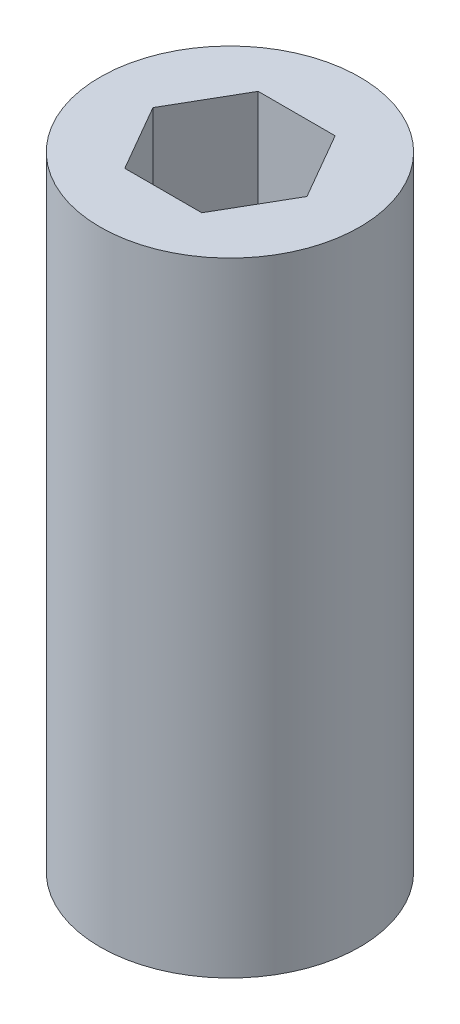
ISO-10303-21;
HEADER;
FILE_DESCRIPTION(('STEP AP214'),'2;1');
FILE_NAME('part.step','',(''),(''),'','','');
FILE_SCHEMA(('AUTOMOTIVE_DESIGN { 1 0 10303 214 1 1 1 1 }'));
ENDSEC;
DATA;
#1=APPLICATION_CONTEXT('core data for automotive mechanical design processes');
#2=APPLICATION_PROTOCOL_DEFINITION('international standard','automotive_design',2000,#1);
#3=PRODUCT_CONTEXT('',#1,'mechanical');
#4=PRODUCT('Part','Part','',(#3));
#5=PRODUCT_RELATED_PRODUCT_CATEGORY('part','',(#4));
#6=PRODUCT_DEFINITION_FORMATION('','',#4);
#7=PRODUCT_DEFINITION_CONTEXT('part definition',#1,'design');
#8=PRODUCT_DEFINITION('design','',#6,#7);
#9=PRODUCT_DEFINITION_SHAPE('','',#8);
#10=(LENGTH_UNIT() NAMED_UNIT(*) SI_UNIT(.MILLI.,.METRE.));
#11=(NAMED_UNIT(*) PLANE_ANGLE_UNIT() SI_UNIT($,.RADIAN.));
#12=(NAMED_UNIT(*) SI_UNIT($,.STERADIAN.) SOLID_ANGLE_UNIT());
#13=UNCERTAINTY_MEASURE_WITH_UNIT(LENGTH_MEASURE(1.E-05),#10,'distance_accuracy_value','');
#14=(GEOMETRIC_REPRESENTATION_CONTEXT(3) GLOBAL_UNCERTAINTY_ASSIGNED_CONTEXT((#13)) GLOBAL_UNIT_ASSIGNED_CONTEXT((#10,
#11,#12)) REPRESENTATION_CONTEXT('',''));
#15=CARTESIAN_POINT('',(0.,0.,0.));
#16=DIRECTION('',(0.,0.,1.));
#17=DIRECTION('',(1.,0.,0.));
#18=AXIS2_PLACEMENT_3D('',#15,#16,#17);
#19=CARTESIAN_POINT('',(0.,45.72,0.));
#20=DIRECTION('',(0.,1.,0.));
#21=DIRECTION('',(0.,0.,1.));
#22=AXIS2_PLACEMENT_3D('',#19,#20,#21);
#23=PLANE('',#22);
#24=CARTESIAN_POINT('',(0.,45.72,0.));
#25=DIRECTION('',(0.,1.,0.));
#26=DIRECTION('',(0.,0.,1.));
#27=AXIS2_PLACEMENT_3D('',#24,#25,#26);
#28=CIRCLE('',#27,9.525);
#29=CARTESIAN_POINT('',(0.,45.72,9.525));
#30=VERTEX_POINT('',#29);
#31=EDGE_CURVE('E11',#30,#30,#28,.T.);
#32=ORIENTED_EDGE('',*,*,#31,.T.);
#33=EDGE_LOOP('',(#32));
#34=FACE_BOUND('',#33,.T.);
#35=DIRECTION('',(-0.5,0.,-0.866025403784439));
#36=VECTOR('',#35,1.);
#37=CARTESIAN_POINT('',(5.64590828240535,45.72,0.));
#38=LINE('',#37,#36);
#39=CARTESIAN_POINT('',(5.64590828240535,45.72,0.));
#40=VERTEX_POINT('',#39);
#41=CARTESIAN_POINT('',(2.82295414120267,45.72,-4.8895));
#42=VERTEX_POINT('',#41);
#43=EDGE_CURVE('E98',#40,#42,#38,.T.);
#44=ORIENTED_EDGE('',*,*,#43,.F.);
#45=DIRECTION('',(0.5,0.,-0.866025403784439));
#46=VECTOR('',#45,1.);
#47=CARTESIAN_POINT('',(2.82295414120267,45.72,4.8895));
#48=LINE('',#47,#46);
#49=CARTESIAN_POINT('',(2.82295414120267,45.72,4.8895));
#50=VERTEX_POINT('',#49);
#51=EDGE_CURVE('E90',#50,#40,#48,.T.);
#52=ORIENTED_EDGE('',*,*,#51,.F.);
#53=DIRECTION('',(1.,0.,0.));
#54=VECTOR('',#53,1.);
#55=CARTESIAN_POINT('',(-2.82295414120268,45.72,4.8895));
#56=LINE('',#55,#54);
#57=CARTESIAN_POINT('',(-2.82295414120268,45.72,4.8895));
#58=VERTEX_POINT('',#57);
#59=EDGE_CURVE('E118',#58,#50,#56,.T.);
#60=ORIENTED_EDGE('',*,*,#59,.F.);
#61=DIRECTION('',(0.5,0.,0.866025403784439));
#62=VECTOR('',#61,1.);
#63=CARTESIAN_POINT('',(-5.64590828240535,45.72,0.));
#64=LINE('',#63,#62);
#65=CARTESIAN_POINT('',(-5.64590828240535,45.72,0.));
#66=VERTEX_POINT('',#65);
#67=EDGE_CURVE('E116',#66,#58,#64,.T.);
#68=ORIENTED_EDGE('',*,*,#67,.F.);
#69=DIRECTION('',(-0.5,0.,0.866025403784439));
#70=VECTOR('',#69,1.);
#71=CARTESIAN_POINT('',(-2.82295414120268,45.72,-4.8895));
#72=LINE('',#71,#70);
#73=CARTESIAN_POINT('',(-2.82295414120268,45.72,-4.8895));
#74=VERTEX_POINT('',#73);
#75=EDGE_CURVE('E112',#74,#66,#72,.T.);
#76=ORIENTED_EDGE('',*,*,#75,.F.);
#77=DIRECTION('',(-1.,0.,0.));
#78=VECTOR('',#77,1.);
#79=CARTESIAN_POINT('',(2.82295414120267,45.72,-4.8895));
#80=LINE('',#79,#78);
#81=EDGE_CURVE('E110',#42,#74,#80,.T.);
#82=ORIENTED_EDGE('',*,*,#81,.F.);
#83=EDGE_LOOP('',(#44,#52,#60,#68,#76,#82));
#84=FACE_BOUND('',#83,.T.);
#85=ADVANCED_FACE('F37',(#34,#84),#23,.T.);
#86=CARTESIAN_POINT('',(0.,0.,0.));
#87=DIRECTION('',(0.,1.,0.));
#88=DIRECTION('',(0.,0.,1.));
#89=AXIS2_PLACEMENT_3D('',#86,#87,#88);
#90=PLANE('',#89);
#91=CARTESIAN_POINT('',(0.,0.,0.));
#92=DIRECTION('',(0.,1.,0.));
#93=DIRECTION('',(0.,0.,1.));
#94=AXIS2_PLACEMENT_3D('',#91,#92,#93);
#95=CIRCLE('',#94,9.525);
#96=CARTESIAN_POINT('',(0.,0.,9.525));
#97=VERTEX_POINT('',#96);
#98=EDGE_CURVE('E41',#97,#97,#95,.T.);
#99=ORIENTED_EDGE('',*,*,#98,.F.);
#100=EDGE_LOOP('',(#99));
#101=FACE_BOUND('',#100,.T.);
#102=DIRECTION('',(0.5,0.,-0.866025403784439));
#103=VECTOR('',#102,1.);
#104=CARTESIAN_POINT('',(2.82295414120267,0.,4.8895));
#105=LINE('',#104,#103);
#106=CARTESIAN_POINT('',(2.82295414120267,0.,4.8895));
#107=VERTEX_POINT('',#106);
#108=CARTESIAN_POINT('',(5.64590828240535,0.,0.));
#109=VERTEX_POINT('',#108);
#110=EDGE_CURVE('E60',#107,#109,#105,.T.);
#111=ORIENTED_EDGE('',*,*,#110,.T.);
#112=DIRECTION('',(-0.5,0.,-0.866025403784439));
#113=VECTOR('',#112,1.);
#114=CARTESIAN_POINT('',(5.64590828240535,0.,0.));
#115=LINE('',#114,#113);
#116=CARTESIAN_POINT('',(2.82295414120267,0.,-4.8895));
#117=VERTEX_POINT('',#116);
#118=EDGE_CURVE('E105',#109,#117,#115,.T.);
#119=ORIENTED_EDGE('',*,*,#118,.T.);
#120=DIRECTION('',(-1.,0.,0.));
#121=VECTOR('',#120,1.);
#122=CARTESIAN_POINT('',(2.82295414120267,0.,-4.8895));
#123=LINE('',#122,#121);
#124=CARTESIAN_POINT('',(-2.82295414120268,0.,-4.8895));
#125=VERTEX_POINT('',#124);
#126=EDGE_CURVE('E122',#117,#125,#123,.T.);
#127=ORIENTED_EDGE('',*,*,#126,.T.);
#128=DIRECTION('',(-0.5,0.,0.866025403784439));
#129=VECTOR('',#128,1.);
#130=CARTESIAN_POINT('',(-2.82295414120268,0.,-4.8895));
#131=LINE('',#130,#129);
#132=CARTESIAN_POINT('',(-5.64590828240535,0.,0.));
#133=VERTEX_POINT('',#132);
#134=EDGE_CURVE('E125',#125,#133,#131,.T.);
#135=ORIENTED_EDGE('',*,*,#134,.T.);
#136=DIRECTION('',(0.5,0.,0.866025403784439));
#137=VECTOR('',#136,1.);
#138=CARTESIAN_POINT('',(-5.64590828240535,0.,0.));
#139=LINE('',#138,#137);
#140=CARTESIAN_POINT('',(-2.82295414120268,0.,4.8895));
#141=VERTEX_POINT('',#140);
#142=EDGE_CURVE('E128',#133,#141,#139,.T.);
#143=ORIENTED_EDGE('',*,*,#142,.T.);
#144=DIRECTION('',(1.,0.,0.));
#145=VECTOR('',#144,1.);
#146=CARTESIAN_POINT('',(-2.82295414120268,0.,4.8895));
#147=LINE('',#146,#145);
#148=EDGE_CURVE('E99',#141,#107,#147,.T.);
#149=ORIENTED_EDGE('',*,*,#148,.T.);
#150=EDGE_LOOP('',(#111,#119,#127,#135,#143,#149));
#151=FACE_BOUND('',#150,.T.);
#152=ADVANCED_FACE('F145',(#101,#151),#90,.F.);
#153=CARTESIAN_POINT('',(0.,45.72,0.));
#154=DIRECTION('',(0.,-1.,0.));
#155=DIRECTION('',(0.,0.,-1.));
#156=AXIS2_PLACEMENT_3D('',#153,#154,#155);
#157=CYLINDRICAL_SURFACE('',#156,9.525);
#158=ORIENTED_EDGE('',*,*,#31,.F.);
#159=EDGE_LOOP('',(#158));
#160=FACE_BOUND('',#159,.T.);
#161=ORIENTED_EDGE('',*,*,#98,.T.);
#162=EDGE_LOOP('',(#161));
#163=FACE_BOUND('',#162,.T.);
#164=ADVANCED_FACE('F39',(#160,#163),#157,.T.);
#165=CARTESIAN_POINT('',(2.82295414120267,45.72,4.8895));
#166=DIRECTION('',(-0.866025403784439,0.,-0.5));
#167=DIRECTION('',(-0.5,0.,0.866025403784439));
#168=AXIS2_PLACEMENT_3D('',#165,#166,#167);
#169=PLANE('',#168);
#170=ORIENTED_EDGE('',*,*,#110,.F.);
#171=DIRECTION('',(0.,-1.,0.));
#172=VECTOR('',#171,1.);
#173=CARTESIAN_POINT('',(2.82295414120267,45.72,4.8895));
#174=LINE('',#173,#172);
#175=EDGE_CURVE('E94',#50,#107,#174,.T.);
#176=ORIENTED_EDGE('',*,*,#175,.F.);
#177=ORIENTED_EDGE('',*,*,#51,.T.);
#178=DIRECTION('',(0.,-1.,0.));
#179=VECTOR('',#178,1.);
#180=CARTESIAN_POINT('',(5.64590828240535,45.72,0.));
#181=LINE('',#180,#179);
#182=EDGE_CURVE('E93',#40,#109,#181,.T.);
#183=ORIENTED_EDGE('',*,*,#182,.T.);
#184=EDGE_LOOP('',(#170,#176,#177,#183));
#185=FACE_BOUND('',#184,.T.);
#186=ADVANCED_FACE('F92',(#185),#169,.T.);
#187=CARTESIAN_POINT('',(5.64590828240535,45.72,0.));
#188=DIRECTION('',(-0.866025403784439,0.,0.5));
#189=DIRECTION('',(0.5,0.,0.866025403784439));
#190=AXIS2_PLACEMENT_3D('',#187,#188,#189);
#191=PLANE('',#190);
#192=ORIENTED_EDGE('',*,*,#118,.F.);
#193=ORIENTED_EDGE('',*,*,#182,.F.);
#194=ORIENTED_EDGE('',*,*,#43,.T.);
#195=DIRECTION('',(0.,-1.,0.));
#196=VECTOR('',#195,1.);
#197=CARTESIAN_POINT('',(2.82295414120267,45.72,-4.8895));
#198=LINE('',#197,#196);
#199=EDGE_CURVE('E106',#42,#117,#198,.T.);
#200=ORIENTED_EDGE('',*,*,#199,.T.);
#201=EDGE_LOOP('',(#192,#193,#194,#200));
#202=FACE_BOUND('',#201,.T.);
#203=ADVANCED_FACE('F102',(#202),#191,.T.);
#204=CARTESIAN_POINT('',(2.82295414120267,45.72,-4.8895));
#205=DIRECTION('',(0.,0.,1.));
#206=DIRECTION('',(1.,0.,0.));
#207=AXIS2_PLACEMENT_3D('',#204,#205,#206);
#208=PLANE('',#207);
#209=ORIENTED_EDGE('',*,*,#126,.F.);
#210=ORIENTED_EDGE('',*,*,#199,.F.);
#211=ORIENTED_EDGE('',*,*,#81,.T.);
#212=DIRECTION('',(0.,-1.,0.));
#213=VECTOR('',#212,1.);
#214=CARTESIAN_POINT('',(-2.82295414120268,45.72,-4.8895));
#215=LINE('',#214,#213);
#216=EDGE_CURVE('E137',#74,#125,#215,.T.);
#217=ORIENTED_EDGE('',*,*,#216,.T.);
#218=EDGE_LOOP('',(#209,#210,#211,#217));
#219=FACE_BOUND('',#218,.T.);
#220=ADVANCED_FACE('F141',(#219),#208,.T.);
#221=CARTESIAN_POINT('',(-2.82295414120268,45.72,-4.8895));
#222=DIRECTION('',(0.866025403784439,0.,0.5));
#223=DIRECTION('',(0.5,0.,-0.866025403784439));
#224=AXIS2_PLACEMENT_3D('',#221,#222,#223);
#225=PLANE('',#224);
#226=ORIENTED_EDGE('',*,*,#134,.F.);
#227=ORIENTED_EDGE('',*,*,#216,.F.);
#228=ORIENTED_EDGE('',*,*,#75,.T.);
#229=DIRECTION('',(0.,-1.,0.));
#230=VECTOR('',#229,1.);
#231=CARTESIAN_POINT('',(-5.64590828240535,45.72,0.));
#232=LINE('',#231,#230);
#233=EDGE_CURVE('E135',#66,#133,#232,.T.);
#234=ORIENTED_EDGE('',*,*,#233,.T.);
#235=EDGE_LOOP('',(#226,#227,#228,#234));
#236=FACE_BOUND('',#235,.T.);
#237=ADVANCED_FACE('F153',(#236),#225,.T.);
#238=CARTESIAN_POINT('',(-5.64590828240535,45.72,0.));
#239=DIRECTION('',(0.866025403784439,0.,-0.5));
#240=DIRECTION('',(-0.5,0.,-0.866025403784439));
#241=AXIS2_PLACEMENT_3D('',#238,#239,#240);
#242=PLANE('',#241);
#243=ORIENTED_EDGE('',*,*,#142,.F.);
#244=ORIENTED_EDGE('',*,*,#233,.F.);
#245=ORIENTED_EDGE('',*,*,#67,.T.);
#246=DIRECTION('',(0.,-1.,0.));
#247=VECTOR('',#246,1.);
#248=CARTESIAN_POINT('',(-2.82295414120268,45.72,4.8895));
#249=LINE('',#248,#247);
#250=EDGE_CURVE('E52',#58,#141,#249,.T.);
#251=ORIENTED_EDGE('',*,*,#250,.T.);
#252=EDGE_LOOP('',(#243,#244,#245,#251));
#253=FACE_BOUND('',#252,.T.);
#254=ADVANCED_FACE('F151',(#253),#242,.T.);
#255=CARTESIAN_POINT('',(-2.82295414120268,45.72,4.8895));
#256=DIRECTION('',(0.,0.,-1.));
#257=DIRECTION('',(-1.,0.,0.));
#258=AXIS2_PLACEMENT_3D('',#255,#256,#257);
#259=PLANE('',#258);
#260=ORIENTED_EDGE('',*,*,#148,.F.);
#261=ORIENTED_EDGE('',*,*,#250,.F.);
#262=ORIENTED_EDGE('',*,*,#59,.T.);
#263=ORIENTED_EDGE('',*,*,#175,.T.);
#264=EDGE_LOOP('',(#260,#261,#262,#263));
#265=FACE_BOUND('',#264,.T.);
#266=ADVANCED_FACE('F147',(#265),#259,.T.);
#267=CLOSED_SHELL('',(#85,#152,#164,#186,#203,#220,#237,#254,#266));
#268=MANIFOLD_SOLID_BREP('B2',#267);
#269=ADVANCED_BREP_SHAPE_REPRESENTATION('',(#18,#268),#14);
#270=SHAPE_DEFINITION_REPRESENTATION(#9,#269);
ENDSEC;
END-ISO-10303-21;
